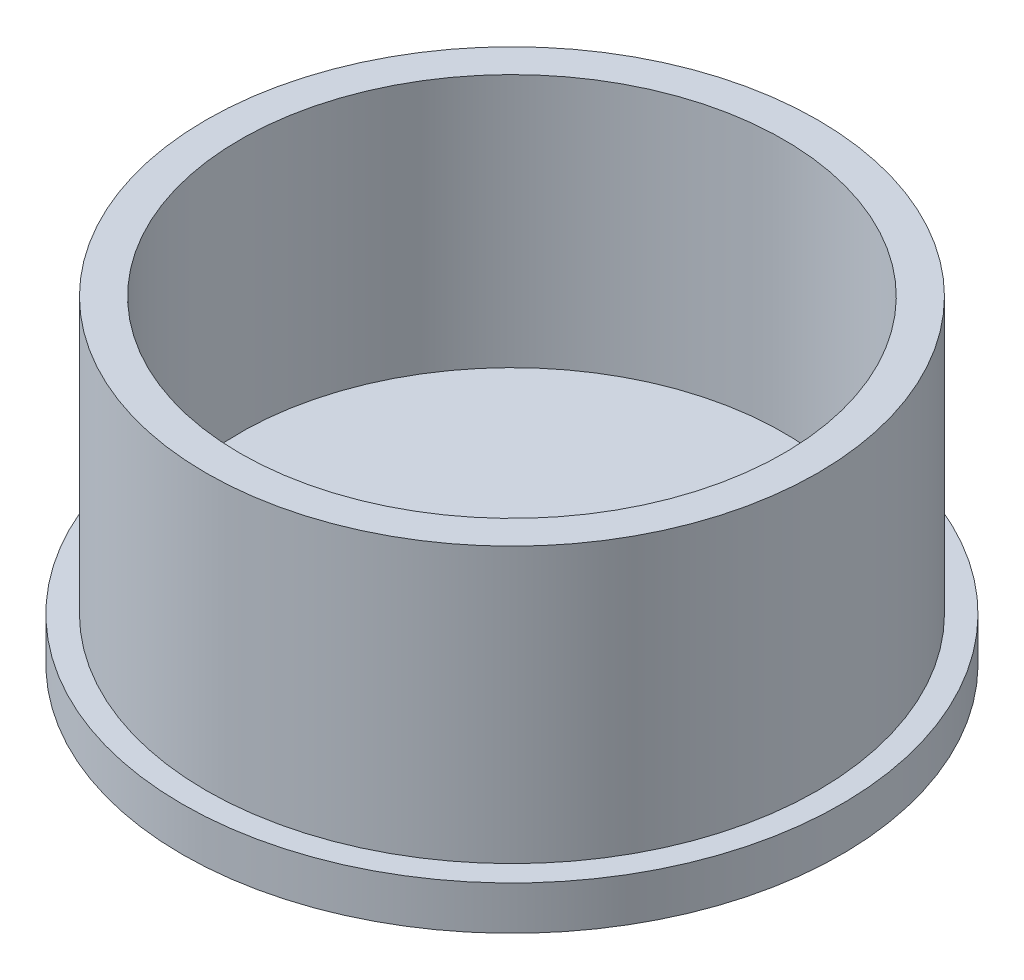
ISO-10303-21;
HEADER;
FILE_DESCRIPTION(('STEP AP214'),'2;1');
FILE_NAME('part.step','',(''),(''),'','','');
FILE_SCHEMA(('AUTOMOTIVE_DESIGN { 1 0 10303 214 1 1 1 1 }'));
ENDSEC;
DATA;
#1=APPLICATION_CONTEXT('core data for automotive mechanical design processes');
#2=APPLICATION_PROTOCOL_DEFINITION('international standard','automotive_design',2000,#1);
#3=PRODUCT_CONTEXT('',#1,'mechanical');
#4=PRODUCT('Part','Part','',(#3));
#5=PRODUCT_RELATED_PRODUCT_CATEGORY('part','',(#4));
#6=PRODUCT_DEFINITION_FORMATION('','',#4);
#7=PRODUCT_DEFINITION_CONTEXT('part definition',#1,'design');
#8=PRODUCT_DEFINITION('design','',#6,#7);
#9=PRODUCT_DEFINITION_SHAPE('','',#8);
#10=(LENGTH_UNIT() NAMED_UNIT(*) SI_UNIT(.MILLI.,.METRE.));
#11=(NAMED_UNIT(*) PLANE_ANGLE_UNIT() SI_UNIT($,.RADIAN.));
#12=(NAMED_UNIT(*) SI_UNIT($,.STERADIAN.) SOLID_ANGLE_UNIT());
#13=UNCERTAINTY_MEASURE_WITH_UNIT(LENGTH_MEASURE(1.E-05),#10,'distance_accuracy_value','');
#14=(GEOMETRIC_REPRESENTATION_CONTEXT(3) GLOBAL_UNCERTAINTY_ASSIGNED_CONTEXT((#13)) GLOBAL_UNIT_ASSIGNED_CONTEXT((#10,
#11,#12)) REPRESENTATION_CONTEXT('',''));
#15=CARTESIAN_POINT('',(0.,0.,0.));
#16=DIRECTION('',(0.,0.,1.));
#17=DIRECTION('',(1.,0.,0.));
#18=AXIS2_PLACEMENT_3D('',#15,#16,#17);
#19=CARTESIAN_POINT('',(0.,1.5748,0.));
#20=DIRECTION('',(0.,-1.,0.));
#21=DIRECTION('',(0.,0.,-1.));
#22=AXIS2_PLACEMENT_3D('',#19,#20,#21);
#23=CYLINDRICAL_SURFACE('',#22,11.90625);
#24=CARTESIAN_POINT('',(0.,1.5748,0.));
#25=DIRECTION('',(0.,1.,0.));
#26=DIRECTION('',(0.,0.,1.));
#27=AXIS2_PLACEMENT_3D('',#24,#25,#26);
#28=CIRCLE('',#27,11.90625);
#29=CARTESIAN_POINT('',(0.,1.5748,11.90625));
#30=VERTEX_POINT('',#29);
#31=EDGE_CURVE('E42',#30,#30,#28,.T.);
#32=ORIENTED_EDGE('',*,*,#31,.F.);
#33=EDGE_LOOP('',(#32));
#34=FACE_BOUND('',#33,.T.);
#35=CARTESIAN_POINT('',(0.,0.,0.));
#36=DIRECTION('',(0.,1.,0.));
#37=DIRECTION('',(0.,0.,1.));
#38=AXIS2_PLACEMENT_3D('',#35,#36,#37);
#39=CIRCLE('',#38,11.90625);
#40=CARTESIAN_POINT('',(0.,0.,11.90625));
#41=VERTEX_POINT('',#40);
#42=EDGE_CURVE('E38',#41,#41,#39,.T.);
#43=ORIENTED_EDGE('',*,*,#42,.T.);
#44=EDGE_LOOP('',(#43));
#45=FACE_BOUND('',#44,.T.);
#46=ADVANCED_FACE('F35',(#34,#45),#23,.T.);
#47=CARTESIAN_POINT('',(0.,1.5748,0.));
#48=DIRECTION('',(0.,1.,0.));
#49=DIRECTION('',(0.,0.,1.));
#50=AXIS2_PLACEMENT_3D('',#47,#48,#49);
#51=PLANE('',#50);
#52=CARTESIAN_POINT('',(0.,1.5748,0.));
#53=DIRECTION('',(0.,1.,0.));
#54=DIRECTION('',(0.,0.,1.));
#55=AXIS2_PLACEMENT_3D('',#52,#53,#54);
#56=CIRCLE('',#55,11.049);
#57=CARTESIAN_POINT('',(0.,1.5748,11.049));
#58=VERTEX_POINT('',#57);
#59=EDGE_CURVE('E10',#58,#58,#56,.T.);
#60=ORIENTED_EDGE('',*,*,#59,.F.);
#61=EDGE_LOOP('',(#60));
#62=FACE_BOUND('',#61,.T.);
#63=ORIENTED_EDGE('',*,*,#31,.T.);
#64=EDGE_LOOP('',(#63));
#65=FACE_BOUND('',#64,.T.);
#66=ADVANCED_FACE('F79',(#62,#65),#51,.T.);
#67=CARTESIAN_POINT('',(0.,0.,0.));
#68=DIRECTION('',(0.,1.,0.));
#69=DIRECTION('',(0.,0.,1.));
#70=AXIS2_PLACEMENT_3D('',#67,#68,#69);
#71=PLANE('',#70);
#72=ORIENTED_EDGE('',*,*,#42,.F.);
#73=EDGE_LOOP('',(#72));
#74=FACE_BOUND('',#73,.T.);
#75=ADVANCED_FACE('F74',(#74),#71,.F.);
#76=CARTESIAN_POINT('',(0.,11.5062,0.));
#77=DIRECTION('',(0.,-1.,0.));
#78=DIRECTION('',(0.,0.,-1.));
#79=AXIS2_PLACEMENT_3D('',#76,#77,#78);
#80=CYLINDRICAL_SURFACE('',#79,11.049);
#81=CARTESIAN_POINT('',(0.,11.5062,0.));
#82=DIRECTION('',(0.,1.,0.));
#83=DIRECTION('',(0.,0.,1.));
#84=AXIS2_PLACEMENT_3D('',#81,#82,#83);
#85=CIRCLE('',#84,11.049);
#86=CARTESIAN_POINT('',(0.,11.5062,11.049));
#87=VERTEX_POINT('',#86);
#88=EDGE_CURVE('E48',#87,#87,#85,.T.);
#89=ORIENTED_EDGE('',*,*,#88,.F.);
#90=EDGE_LOOP('',(#89));
#91=FACE_BOUND('',#90,.T.);
#92=ORIENTED_EDGE('',*,*,#59,.T.);
#93=EDGE_LOOP('',(#92));
#94=FACE_BOUND('',#93,.T.);
#95=ADVANCED_FACE('F69',(#91,#94),#80,.T.);
#96=CARTESIAN_POINT('',(0.,11.5062,0.));
#97=DIRECTION('',(0.,1.,0.));
#98=DIRECTION('',(0.,0.,1.));
#99=AXIS2_PLACEMENT_3D('',#96,#97,#98);
#100=PLANE('',#99);
#101=CARTESIAN_POINT('',(0.,11.5062,0.));
#102=DIRECTION('',(0.,1.,0.));
#103=DIRECTION('',(0.,0.,1.));
#104=AXIS2_PLACEMENT_3D('',#101,#102,#103);
#105=CIRCLE('',#104,9.8183538689212);
#106=CARTESIAN_POINT('',(0.,11.5062,9.8183538689212));
#107=VERTEX_POINT('',#106);
#108=EDGE_CURVE('E52',#107,#107,#105,.T.);
#109=ORIENTED_EDGE('',*,*,#108,.F.);
#110=EDGE_LOOP('',(#109));
#111=FACE_BOUND('',#110,.T.);
#112=ORIENTED_EDGE('',*,*,#88,.T.);
#113=EDGE_LOOP('',(#112));
#114=FACE_BOUND('',#113,.T.);
#115=ADVANCED_FACE('F63',(#111,#114),#100,.T.);
#116=CARTESIAN_POINT('',(0.,2.3368,0.));
#117=DIRECTION('',(0.,1.,0.));
#118=DIRECTION('',(0.,0.,1.));
#119=AXIS2_PLACEMENT_3D('',#116,#117,#118);
#120=CYLINDRICAL_SURFACE('',#119,9.8183538689212);
#121=CARTESIAN_POINT('',(0.,2.3368,0.));
#122=DIRECTION('',(0.,1.,0.));
#123=DIRECTION('',(0.,0.,1.));
#124=AXIS2_PLACEMENT_3D('',#121,#122,#123);
#125=CIRCLE('',#124,9.8183538689212);
#126=CARTESIAN_POINT('',(0.,2.3368,9.8183538689212));
#127=VERTEX_POINT('',#126);
#128=EDGE_CURVE('E51',#127,#127,#125,.T.);
#129=CARTESIAN_POINT('',(0.,2.3368,9.8183538689212));
#130=CARTESIAN_POINT('',(0.,2.43231458333333,9.8183538689212));
#131=CARTESIAN_POINT('',(0.,2.52782916666667,9.8183538689212));
#132=CARTESIAN_POINT('',(0.,2.71885833333333,9.8183538689212));
#133=CARTESIAN_POINT('',(0.,2.81437291666667,9.8183538689212));
#134=CARTESIAN_POINT('',(0.,3.00540208333333,9.8183538689212));
#135=CARTESIAN_POINT('',(0.,3.10091666666667,9.8183538689212));
#136=CARTESIAN_POINT('',(0.,3.29194583333333,9.8183538689212));
#137=CARTESIAN_POINT('',(0.,3.38746041666667,9.8183538689212));
#138=CARTESIAN_POINT('',(0.,3.57848958333333,9.8183538689212));
#139=CARTESIAN_POINT('',(0.,3.67400416666667,9.8183538689212));
#140=CARTESIAN_POINT('',(0.,3.86503333333333,9.8183538689212));
#141=CARTESIAN_POINT('',(0.,3.96054791666667,9.8183538689212));
#142=CARTESIAN_POINT('',(0.,4.15157708333333,9.8183538689212));
#143=CARTESIAN_POINT('',(0.,4.24709166666667,9.8183538689212));
#144=CARTESIAN_POINT('',(0.,4.43812083333333,9.8183538689212));
#145=CARTESIAN_POINT('',(0.,4.53363541666667,9.8183538689212));
#146=CARTESIAN_POINT('',(0.,4.72466458333333,9.8183538689212));
#147=CARTESIAN_POINT('',(0.,4.82017916666667,9.8183538689212));
#148=CARTESIAN_POINT('',(0.,5.01120833333333,9.8183538689212));
#149=CARTESIAN_POINT('',(0.,5.10672291666667,9.8183538689212));
#150=CARTESIAN_POINT('',(0.,5.29775208333333,9.8183538689212));
#151=CARTESIAN_POINT('',(0.,5.39326666666667,9.8183538689212));
#152=CARTESIAN_POINT('',(0.,5.58429583333333,9.8183538689212));
#153=CARTESIAN_POINT('',(0.,5.67981041666667,9.8183538689212));
#154=CARTESIAN_POINT('',(0.,5.87083958333333,9.8183538689212));
#155=CARTESIAN_POINT('',(0.,5.96635416666667,9.8183538689212));
#156=CARTESIAN_POINT('',(0.,6.15738333333333,9.8183538689212));
#157=CARTESIAN_POINT('',(0.,6.25289791666667,9.8183538689212));
#158=CARTESIAN_POINT('',(0.,6.44392708333333,9.8183538689212));
#159=CARTESIAN_POINT('',(0.,6.53944166666667,9.8183538689212));
#160=CARTESIAN_POINT('',(0.,6.73047083333333,9.8183538689212));
#161=CARTESIAN_POINT('',(0.,6.82598541666667,9.8183538689212));
#162=CARTESIAN_POINT('',(0.,7.01701458333333,9.8183538689212));
#163=CARTESIAN_POINT('',(0.,7.11252916666667,9.8183538689212));
#164=CARTESIAN_POINT('',(0.,7.30355833333333,9.8183538689212));
#165=CARTESIAN_POINT('',(0.,7.39907291666667,9.8183538689212));
#166=CARTESIAN_POINT('',(0.,7.59010208333333,9.8183538689212));
#167=CARTESIAN_POINT('',(0.,7.68561666666667,9.8183538689212));
#168=CARTESIAN_POINT('',(0.,7.87664583333333,9.8183538689212));
#169=CARTESIAN_POINT('',(0.,7.97216041666667,9.8183538689212));
#170=CARTESIAN_POINT('',(0.,8.16318958333333,9.8183538689212));
#171=CARTESIAN_POINT('',(0.,8.25870416666667,9.8183538689212));
#172=CARTESIAN_POINT('',(0.,8.44973333333333,9.8183538689212));
#173=CARTESIAN_POINT('',(0.,8.54524791666667,9.8183538689212));
#174=CARTESIAN_POINT('',(0.,8.73627708333333,9.8183538689212));
#175=CARTESIAN_POINT('',(0.,8.83179166666667,9.8183538689212));
#176=CARTESIAN_POINT('',(0.,9.02282083333333,9.8183538689212));
#177=CARTESIAN_POINT('',(0.,9.11833541666667,9.8183538689212));
#178=CARTESIAN_POINT('',(0.,9.30936458333333,9.8183538689212));
#179=CARTESIAN_POINT('',(0.,9.40487916666667,9.8183538689212));
#180=CARTESIAN_POINT('',(0.,9.59590833333333,9.8183538689212));
#181=CARTESIAN_POINT('',(0.,9.69142291666667,9.8183538689212));
#182=CARTESIAN_POINT('',(0.,9.88245208333333,9.8183538689212));
#183=CARTESIAN_POINT('',(0.,9.97796666666667,9.8183538689212));
#184=CARTESIAN_POINT('',(0.,10.1689958333333,9.8183538689212));
#185=CARTESIAN_POINT('',(0.,10.2645104166667,9.8183538689212));
#186=CARTESIAN_POINT('',(0.,10.4555395833333,9.8183538689212));
#187=CARTESIAN_POINT('',(0.,10.5510541666667,9.8183538689212));
#188=CARTESIAN_POINT('',(0.,10.7420833333333,9.8183538689212));
#189=CARTESIAN_POINT('',(0.,10.8375979166667,9.8183538689212));
#190=CARTESIAN_POINT('',(0.,11.0286270833333,9.8183538689212));
#191=CARTESIAN_POINT('',(0.,11.1241416666667,9.8183538689212));
#192=CARTESIAN_POINT('',(0.,11.3151708333333,9.8183538689212));
#193=CARTESIAN_POINT('',(0.,11.4106854166667,9.8183538689212));
#194=CARTESIAN_POINT('',(0.,11.5062,9.8183538689212));
#195=B_SPLINE_CURVE_WITH_KNOTS('',3,(#129,#130,#131,#132,#133,#134,#135,#136,#137,#138,#139,
#140,#141,#142,#143,#144,#145,#146,#147,#148,#149,#150,#151,#152,#153,#154,#155,#156,#157,#158,
#159,#160,#161,#162,#163,#164,#165,#166,#167,#168,#169,#170,#171,#172,#173,#174,#175,#176,#177,
#178,#179,#180,#181,#182,#183,#184,#185,#186,#187,#188,#189,#190,#191,#192,#193,#194),
.UNSPECIFIED.,.F.,.F.,(4,2,2,2,2,2,2,2,2,2,2,2,2,2,2,2,2,2,2,2,2,2,2,2,2,2,2,2,2,2,2,2,4),(0.,
0.28654375,0.5730875,0.859631249999999,1.146175,1.43271875,1.7192625,2.00580625,2.29235,
2.57889375,2.8654375,3.15198125,3.438525,3.72506875,4.0116125,4.29815625,4.5847,4.87124375,
5.1577875,5.44433125,5.730875,6.01741875,6.3039625,6.59050625,6.87705,7.16359375,7.4501375,
7.73668125,8.023225,8.30976875,8.5963125,8.88285625,9.1694),.UNSPECIFIED.);
#196=EDGE_CURVE('BSEAM60',#127,#107,#195,.T.);
#197=ORIENTED_EDGE('',*,*,#128,.F.);
#198=ORIENTED_EDGE('',*,*,#108,.T.);
#199=ORIENTED_EDGE('',*,*,#196,.T.);
#200=ORIENTED_EDGE('',*,*,#196,.F.);
#201=EDGE_LOOP('',(#197,#199,#198,#200));
#202=FACE_BOUND('',#201,.T.);
#203=ADVANCED_FACE('F60',(#202),#120,.F.);
#204=CARTESIAN_POINT('',(0.,2.3368,0.));
#205=DIRECTION('',(0.,1.,0.));
#206=DIRECTION('',(0.,0.,1.));
#207=AXIS2_PLACEMENT_3D('',#204,#205,#206);
#208=PLANE('',#207);
#209=ORIENTED_EDGE('',*,*,#128,.T.);
#210=EDGE_LOOP('',(#209));
#211=FACE_BOUND('',#210,.T.);
#212=ADVANCED_FACE('F58',(#211),#208,.T.);
#213=CLOSED_SHELL('',(#46,#66,#75,#95,#115,#203,#212));
#214=MANIFOLD_SOLID_BREP('B2',#213);
#215=ADVANCED_BREP_SHAPE_REPRESENTATION('',(#18,#214),#14);
#216=SHAPE_DEFINITION_REPRESENTATION(#9,#215);
ENDSEC;
END-ISO-10303-21;
